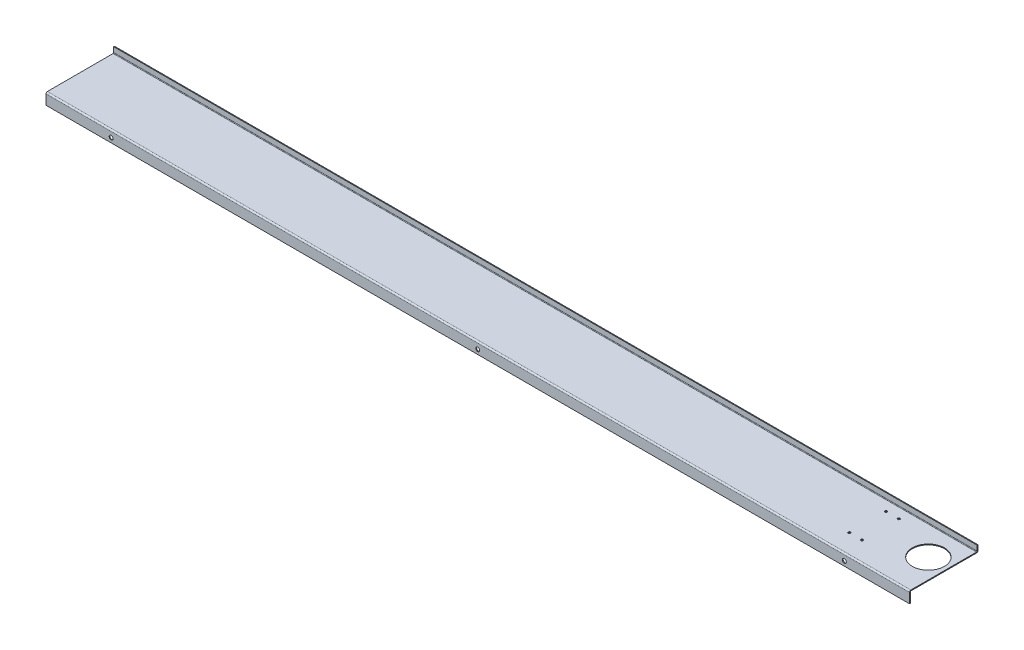
ISO-10303-21;
HEADER;
FILE_DESCRIPTION(('STEP AP214'),'2;1');
FILE_NAME('part.step','',(''),(''),'','','');
FILE_SCHEMA(('AUTOMOTIVE_DESIGN { 1 0 10303 214 1 1 1 1 }'));
ENDSEC;
DATA;
#1=APPLICATION_CONTEXT('core data for automotive mechanical design processes');
#2=APPLICATION_PROTOCOL_DEFINITION('international standard','automotive_design',2000,#1);
#3=PRODUCT_CONTEXT('',#1,'mechanical');
#4=PRODUCT('Part','Part','',(#3));
#5=PRODUCT_RELATED_PRODUCT_CATEGORY('part','',(#4));
#6=PRODUCT_DEFINITION_FORMATION('','',#4);
#7=PRODUCT_DEFINITION_CONTEXT('part definition',#1,'design');
#8=PRODUCT_DEFINITION('design','',#6,#7);
#9=PRODUCT_DEFINITION_SHAPE('','',#8);
#10=(LENGTH_UNIT() NAMED_UNIT(*) SI_UNIT(.MILLI.,.METRE.));
#11=(NAMED_UNIT(*) PLANE_ANGLE_UNIT() SI_UNIT($,.RADIAN.));
#12=(NAMED_UNIT(*) SI_UNIT($,.STERADIAN.) SOLID_ANGLE_UNIT());
#13=UNCERTAINTY_MEASURE_WITH_UNIT(LENGTH_MEASURE(1.E-05),#10,'distance_accuracy_value','');
#14=(GEOMETRIC_REPRESENTATION_CONTEXT(3) GLOBAL_UNCERTAINTY_ASSIGNED_CONTEXT((#13)) GLOBAL_UNIT_ASSIGNED_CONTEXT((#10,
#11,#12)) REPRESENTATION_CONTEXT('',''));
#15=CARTESIAN_POINT('',(0.,0.,0.));
#16=DIRECTION('',(0.,0.,1.));
#17=DIRECTION('',(1.,0.,0.));
#18=AXIS2_PLACEMENT_3D('',#15,#16,#17);
#19=CARTESIAN_POINT('',(765.5,0.,-1.5));
#20=DIRECTION('',(0.,0.,1.));
#21=DIRECTION('',(1.,0.,0.));
#22=AXIS2_PLACEMENT_3D('',#19,#20,#21);
#23=PLANE('',#22);
#24=CARTESIAN_POINT('',(650.,8.,-1.5));
#25=DIRECTION('',(0.,0.,-1.));
#26=DIRECTION('',(-1.,0.,0.));
#27=AXIS2_PLACEMENT_3D('',#24,#25,#26);
#28=CIRCLE('',#27,3.49999999999995);
#29=CARTESIAN_POINT('',(646.5,8.,-1.5));
#30=VERTEX_POINT('',#29);
#31=EDGE_CURVE('E269',#30,#30,#28,.T.);
#32=ORIENTED_EDGE('',*,*,#31,.F.);
#33=EDGE_LOOP('',(#32));
#34=FACE_BOUND('',#33,.T.);
#35=CARTESIAN_POINT('',(0.,8.,-1.5));
#36=DIRECTION('',(0.,0.,-1.));
#37=DIRECTION('',(-1.,0.,0.));
#38=AXIS2_PLACEMENT_3D('',#35,#36,#37);
#39=CIRCLE('',#38,3.49999999999999);
#40=CARTESIAN_POINT('',(-3.49999999999999,8.,-1.5));
#41=VERTEX_POINT('',#40);
#42=EDGE_CURVE('E275',#41,#41,#39,.T.);
#43=ORIENTED_EDGE('',*,*,#42,.F.);
#44=EDGE_LOOP('',(#43));
#45=FACE_BOUND('',#44,.T.);
#46=DIRECTION('',(0.,1.,0.));
#47=VECTOR('',#46,1.);
#48=CARTESIAN_POINT('',(-765.5,0.,-1.5));
#49=LINE('',#48,#47);
#50=CARTESIAN_POINT('',(-765.5,0.,-1.5));
#51=VERTEX_POINT('',#50);
#52=CARTESIAN_POINT('',(-765.5,17.5,-1.5));
#53=VERTEX_POINT('',#52);
#54=EDGE_CURVE('E202',#51,#53,#49,.T.);
#55=ORIENTED_EDGE('',*,*,#54,.T.);
#56=DIRECTION('',(-1.,0.,0.));
#57=VECTOR('',#56,1.);
#58=CARTESIAN_POINT('',(765.5,17.5,-1.5));
#59=LINE('',#58,#57);
#60=CARTESIAN_POINT('',(765.5,17.5,-1.5));
#61=VERTEX_POINT('',#60);
#62=EDGE_CURVE('E167',#61,#53,#59,.T.);
#63=ORIENTED_EDGE('',*,*,#62,.F.);
#64=DIRECTION('',(0.,1.,0.));
#65=VECTOR('',#64,1.);
#66=CARTESIAN_POINT('',(765.5,0.,-1.5));
#67=LINE('',#66,#65);
#68=CARTESIAN_POINT('',(765.5,0.,-1.5));
#69=VERTEX_POINT('',#68);
#70=EDGE_CURVE('E158',#69,#61,#67,.T.);
#71=ORIENTED_EDGE('',*,*,#70,.F.);
#72=DIRECTION('',(-1.,0.,0.));
#73=VECTOR('',#72,1.);
#74=CARTESIAN_POINT('',(765.5,0.,-1.5));
#75=LINE('',#74,#73);
#76=EDGE_CURVE('E214',#69,#51,#75,.T.);
#77=ORIENTED_EDGE('',*,*,#76,.T.);
#78=EDGE_LOOP('',(#55,#63,#71,#77));
#79=FACE_BOUND('',#78,.T.);
#80=CARTESIAN_POINT('',(-650.,8.,-1.5));
#81=DIRECTION('',(0.,0.,-1.));
#82=DIRECTION('',(-1.,0.,0.));
#83=AXIS2_PLACEMENT_3D('',#80,#81,#82);
#84=CIRCLE('',#83,3.49999999999995);
#85=CARTESIAN_POINT('',(-653.5,8.,-1.5));
#86=VERTEX_POINT('',#85);
#87=EDGE_CURVE('E281',#86,#86,#84,.T.);
#88=ORIENTED_EDGE('',*,*,#87,.F.);
#89=EDGE_LOOP('',(#88));
#90=FACE_BOUND('',#89,.T.);
#91=ADVANCED_FACE('F41',(#34,#45,#79,#90),#23,.F.);
#92=CARTESIAN_POINT('',(765.5,20.,-2.5));
#93=DIRECTION('',(1.,0.,0.));
#94=DIRECTION('',(0.,0.,-1.));
#95=AXIS2_PLACEMENT_3D('',#92,#93,#94);
#96=PLANE('',#95);
#97=DIRECTION('',(0.,-1.,0.));
#98=VECTOR('',#97,1.);
#99=CARTESIAN_POINT('',(765.5,20.,-2.5));
#100=LINE('',#99,#98);
#101=CARTESIAN_POINT('',(765.5,20.,-2.5));
#102=VERTEX_POINT('',#101);
#103=CARTESIAN_POINT('',(765.5,18.5,-2.5));
#104=VERTEX_POINT('',#103);
#105=EDGE_CURVE('E11',#102,#104,#100,.T.);
#106=ORIENTED_EDGE('',*,*,#105,.F.);
#107=CARTESIAN_POINT('',(765.5,17.5,-2.5));
#108=DIRECTION('',(1.,0.,0.));
#109=DIRECTION('',(0.,0.,-1.));
#110=AXIS2_PLACEMENT_3D('',#107,#108,#109);
#111=CIRCLE('',#110,2.5);
#112=CARTESIAN_POINT('',(765.5,17.5,0.));
#113=VERTEX_POINT('',#112);
#114=EDGE_CURVE('E297',#113,#102,#111,.F.);
#115=ORIENTED_EDGE('',*,*,#114,.F.);
#116=DIRECTION('',(0.,0.,1.));
#117=VECTOR('',#116,1.);
#118=CARTESIAN_POINT('',(765.5,17.5,-1.5));
#119=LINE('',#118,#117);
#120=EDGE_CURVE('E51',#61,#113,#119,.T.);
#121=ORIENTED_EDGE('',*,*,#120,.F.);
#122=CARTESIAN_POINT('',(765.5,17.5,-2.5));
#123=DIRECTION('',(1.,0.,0.));
#124=DIRECTION('',(0.,0.,-1.));
#125=AXIS2_PLACEMENT_3D('',#122,#123,#124);
#126=CIRCLE('',#125,1.);
#127=EDGE_CURVE('E153',#61,#104,#126,.F.);
#128=ORIENTED_EDGE('',*,*,#127,.T.);
#129=EDGE_LOOP('',(#106,#115,#121,#128));
#130=FACE_BOUND('',#129,.T.);
#131=ADVANCED_FACE('F43',(#130),#96,.T.);
#132=CARTESIAN_POINT('',(765.5,17.5,-1.5));
#133=DIRECTION('',(1.,0.,0.));
#134=DIRECTION('',(0.,0.,-1.));
#135=AXIS2_PLACEMENT_3D('',#132,#133,#134);
#136=PLANE('',#135);
#137=DIRECTION('',(0.,0.,-1.));
#138=VECTOR('',#137,1.);
#139=CARTESIAN_POINT('',(765.5,20.,0.));
#140=LINE('',#139,#138);
#141=CARTESIAN_POINT('',(765.5,20.,-119.));
#142=VERTEX_POINT('',#141);
#143=EDGE_CURVE('E147',#102,#142,#140,.T.);
#144=ORIENTED_EDGE('',*,*,#143,.F.);
#145=ORIENTED_EDGE('',*,*,#105,.T.);
#146=DIRECTION('',(0.,0.,-1.));
#147=VECTOR('',#146,1.);
#148=CARTESIAN_POINT('',(765.5,18.5,0.));
#149=LINE('',#148,#147);
#150=CARTESIAN_POINT('',(765.5,18.5,-119.));
#151=VERTEX_POINT('',#150);
#152=EDGE_CURVE('E144',#104,#151,#149,.T.);
#153=ORIENTED_EDGE('',*,*,#152,.T.);
#154=DIRECTION('',(0.,1.,0.));
#155=VECTOR('',#154,1.);
#156=CARTESIAN_POINT('',(765.5,18.5,-119.));
#157=LINE('',#156,#155);
#158=EDGE_CURVE('E236',#151,#142,#157,.T.);
#159=ORIENTED_EDGE('',*,*,#158,.T.);
#160=EDGE_LOOP('',(#144,#145,#153,#159));
#161=FACE_BOUND('',#160,.T.);
#162=ADVANCED_FACE('F142',(#161),#136,.T.);
#163=CARTESIAN_POINT('',(-765.5,17.5,0.));
#164=DIRECTION('',(-1.,0.,0.));
#165=DIRECTION('',(0.,0.,1.));
#166=AXIS2_PLACEMENT_3D('',#163,#164,#165);
#167=PLANE('',#166);
#168=DIRECTION('',(0.,0.,-1.));
#169=VECTOR('',#168,1.);
#170=CARTESIAN_POINT('',(-765.5,17.5,0.));
#171=LINE('',#170,#169);
#172=CARTESIAN_POINT('',(-765.5,17.5,0.));
#173=VERTEX_POINT('',#172);
#174=EDGE_CURVE('E241',#173,#53,#171,.T.);
#175=ORIENTED_EDGE('',*,*,#174,.F.);
#176=CARTESIAN_POINT('',(-765.5,17.5,-2.5));
#177=DIRECTION('',(1.,0.,0.));
#178=DIRECTION('',(0.,0.,-1.));
#179=AXIS2_PLACEMENT_3D('',#176,#177,#178);
#180=CIRCLE('',#179,2.5);
#181=CARTESIAN_POINT('',(-765.5,20.,-2.5));
#182=VERTEX_POINT('',#181);
#183=EDGE_CURVE('E193',#173,#182,#180,.F.);
#184=ORIENTED_EDGE('',*,*,#183,.T.);
#185=DIRECTION('',(0.,1.,0.));
#186=VECTOR('',#185,1.);
#187=CARTESIAN_POINT('',(-765.5,18.5,-2.5));
#188=LINE('',#187,#186);
#189=CARTESIAN_POINT('',(-765.5,18.5,-2.5));
#190=VERTEX_POINT('',#189);
#191=EDGE_CURVE('E239',#190,#182,#188,.T.);
#192=ORIENTED_EDGE('',*,*,#191,.F.);
#193=CARTESIAN_POINT('',(-765.5,17.5,-2.5));
#194=DIRECTION('',(1.,0.,0.));
#195=DIRECTION('',(0.,0.,-1.));
#196=AXIS2_PLACEMENT_3D('',#193,#194,#195);
#197=CIRCLE('',#196,1.);
#198=EDGE_CURVE('E165',#53,#190,#197,.F.);
#199=ORIENTED_EDGE('',*,*,#198,.F.);
#200=EDGE_LOOP('',(#175,#184,#192,#199));
#201=FACE_BOUND('',#200,.T.);
#202=ADVANCED_FACE('F315',(#201),#167,.T.);
#203=CARTESIAN_POINT('',(-765.5,18.5,-2.5));
#204=DIRECTION('',(-1.,0.,0.));
#205=DIRECTION('',(0.,0.,1.));
#206=AXIS2_PLACEMENT_3D('',#203,#204,#205);
#207=PLANE('',#206);
#208=DIRECTION('',(0.,1.,0.));
#209=VECTOR('',#208,1.);
#210=CARTESIAN_POINT('',(-765.5,0.,0.));
#211=LINE('',#210,#209);
#212=CARTESIAN_POINT('',(-765.5,0.,0.));
#213=VERTEX_POINT('',#212);
#214=EDGE_CURVE('E196',#213,#173,#211,.T.);
#215=ORIENTED_EDGE('',*,*,#214,.T.);
#216=ORIENTED_EDGE('',*,*,#174,.T.);
#217=ORIENTED_EDGE('',*,*,#54,.F.);
#218=DIRECTION('',(0.,0.,1.));
#219=VECTOR('',#218,1.);
#220=CARTESIAN_POINT('',(-765.5,0.,-1.5));
#221=LINE('',#220,#219);
#222=EDGE_CURVE('E199',#51,#213,#221,.T.);
#223=ORIENTED_EDGE('',*,*,#222,.T.);
#224=EDGE_LOOP('',(#215,#216,#217,#223));
#225=FACE_BOUND('',#224,.T.);
#226=ADVANCED_FACE('F578',(#225),#207,.T.);
#227=CARTESIAN_POINT('',(765.5,21.,-120.));
#228=DIRECTION('',(1.,0.,0.));
#229=DIRECTION('',(0.,0.,-1.));
#230=AXIS2_PLACEMENT_3D('',#227,#228,#229);
#231=PLANE('',#230);
#232=DIRECTION('',(0.,0.,-1.));
#233=VECTOR('',#232,1.);
#234=CARTESIAN_POINT('',(765.5,21.,-120.));
#235=LINE('',#234,#233);
#236=CARTESIAN_POINT('',(765.5,21.,-120.));
#237=VERTEX_POINT('',#236);
#238=CARTESIAN_POINT('',(765.5,21.,-121.5));
#239=VERTEX_POINT('',#238);
#240=EDGE_CURVE('E60',#237,#239,#235,.T.);
#241=ORIENTED_EDGE('',*,*,#240,.F.);
#242=CARTESIAN_POINT('',(765.5,21.,-119.));
#243=DIRECTION('',(-1.,0.,0.));
#244=DIRECTION('',(0.,0.,1.));
#245=AXIS2_PLACEMENT_3D('',#242,#243,#244);
#246=CIRCLE('',#245,1.);
#247=EDGE_CURVE('E293',#142,#237,#246,.F.);
#248=ORIENTED_EDGE('',*,*,#247,.F.);
#249=ORIENTED_EDGE('',*,*,#158,.F.);
#250=CARTESIAN_POINT('',(765.5,21.,-119.));
#251=DIRECTION('',(1.,0.,0.));
#252=DIRECTION('',(0.,0.,-1.));
#253=AXIS2_PLACEMENT_3D('',#250,#251,#252);
#254=CIRCLE('',#253,2.5);
#255=EDGE_CURVE('E173',#151,#239,#254,.T.);
#256=ORIENTED_EDGE('',*,*,#255,.T.);
#257=EDGE_LOOP('',(#241,#248,#249,#256));
#258=FACE_BOUND('',#257,.T.);
#259=ADVANCED_FACE('F568',(#258),#231,.T.);
#260=CARTESIAN_POINT('',(765.5,18.5,-119.));
#261=DIRECTION('',(1.,0.,0.));
#262=DIRECTION('',(0.,0.,-1.));
#263=AXIS2_PLACEMENT_3D('',#260,#261,#262);
#264=PLANE('',#263);
#265=DIRECTION('',(0.,1.,0.));
#266=VECTOR('',#265,1.);
#267=CARTESIAN_POINT('',(765.5,20.,-120.));
#268=LINE('',#267,#266);
#269=CARTESIAN_POINT('',(765.5,30.,-120.));
#270=VERTEX_POINT('',#269);
#271=EDGE_CURVE('E290',#237,#270,#268,.T.);
#272=ORIENTED_EDGE('',*,*,#271,.F.);
#273=ORIENTED_EDGE('',*,*,#240,.T.);
#274=DIRECTION('',(0.,1.,0.));
#275=VECTOR('',#274,1.);
#276=CARTESIAN_POINT('',(765.5,20.,-121.5));
#277=LINE('',#276,#275);
#278=CARTESIAN_POINT('',(765.5,30.,-121.5));
#279=VERTEX_POINT('',#278);
#280=EDGE_CURVE('E114',#239,#279,#277,.T.);
#281=ORIENTED_EDGE('',*,*,#280,.T.);
#282=DIRECTION('',(0.,0.,-1.));
#283=VECTOR('',#282,1.);
#284=CARTESIAN_POINT('',(765.5,30.,-120.));
#285=LINE('',#284,#283);
#286=EDGE_CURVE('E287',#270,#279,#285,.T.);
#287=ORIENTED_EDGE('',*,*,#286,.F.);
#288=EDGE_LOOP('',(#272,#273,#281,#287));
#289=FACE_BOUND('',#288,.T.);
#290=ADVANCED_FACE('F342',(#289),#264,.T.);
#291=CARTESIAN_POINT('',(-765.5,20.,-119.));
#292=DIRECTION('',(-1.,0.,0.));
#293=DIRECTION('',(0.,0.,1.));
#294=AXIS2_PLACEMENT_3D('',#291,#292,#293);
#295=PLANE('',#294);
#296=DIRECTION('',(0.,-1.,0.));
#297=VECTOR('',#296,1.);
#298=CARTESIAN_POINT('',(-765.5,20.,-119.));
#299=LINE('',#298,#297);
#300=CARTESIAN_POINT('',(-765.5,20.,-119.));
#301=VERTEX_POINT('',#300);
#302=CARTESIAN_POINT('',(-765.5,18.5,-119.));
#303=VERTEX_POINT('',#302);
#304=EDGE_CURVE('E101',#301,#303,#299,.T.);
#305=ORIENTED_EDGE('',*,*,#304,.F.);
#306=CARTESIAN_POINT('',(-765.5,21.,-119.));
#307=DIRECTION('',(-1.,0.,0.));
#308=DIRECTION('',(0.,0.,1.));
#309=AXIS2_PLACEMENT_3D('',#306,#307,#308);
#310=CIRCLE('',#309,1.);
#311=CARTESIAN_POINT('',(-765.5,21.,-120.));
#312=VERTEX_POINT('',#311);
#313=EDGE_CURVE('E189',#301,#312,#310,.F.);
#314=ORIENTED_EDGE('',*,*,#313,.T.);
#315=DIRECTION('',(0.,0.,1.));
#316=VECTOR('',#315,1.);
#317=CARTESIAN_POINT('',(-765.5,21.,-121.5));
#318=LINE('',#317,#316);
#319=CARTESIAN_POINT('',(-765.5,21.,-121.5));
#320=VERTEX_POINT('',#319);
#321=EDGE_CURVE('E108',#320,#312,#318,.T.);
#322=ORIENTED_EDGE('',*,*,#321,.F.);
#323=CARTESIAN_POINT('',(-765.5,21.,-119.));
#324=DIRECTION('',(1.,0.,0.));
#325=DIRECTION('',(0.,0.,-1.));
#326=AXIS2_PLACEMENT_3D('',#323,#324,#325);
#327=CIRCLE('',#326,2.5);
#328=EDGE_CURVE('E208',#303,#320,#327,.T.);
#329=ORIENTED_EDGE('',*,*,#328,.F.);
#330=EDGE_LOOP('',(#305,#314,#322,#329));
#331=FACE_BOUND('',#330,.T.);
#332=ADVANCED_FACE('F330',(#331),#295,.T.);
#333=CARTESIAN_POINT('',(-765.5,21.,-121.5));
#334=DIRECTION('',(-1.,0.,0.));
#335=DIRECTION('',(0.,0.,1.));
#336=AXIS2_PLACEMENT_3D('',#333,#334,#335);
#337=PLANE('',#336);
#338=DIRECTION('',(0.,0.,-1.));
#339=VECTOR('',#338,1.);
#340=CARTESIAN_POINT('',(-765.5,20.,0.));
#341=LINE('',#340,#339);
#342=EDGE_CURVE('E191',#182,#301,#341,.T.);
#343=ORIENTED_EDGE('',*,*,#342,.T.);
#344=ORIENTED_EDGE('',*,*,#304,.T.);
#345=DIRECTION('',(0.,0.,-1.));
#346=VECTOR('',#345,1.);
#347=CARTESIAN_POINT('',(-765.5,18.5,0.));
#348=LINE('',#347,#346);
#349=EDGE_CURVE('E206',#190,#303,#348,.T.);
#350=ORIENTED_EDGE('',*,*,#349,.F.);
#351=ORIENTED_EDGE('',*,*,#191,.T.);
#352=EDGE_LOOP('',(#343,#344,#350,#351));
#353=FACE_BOUND('',#352,.T.);
#354=ADVANCED_FACE('F317',(#353),#337,.T.);
#355=CARTESIAN_POINT('',(765.5,20.,-121.5));
#356=DIRECTION('',(0.,0.,1.));
#357=DIRECTION('',(1.,0.,0.));
#358=AXIS2_PLACEMENT_3D('',#355,#356,#357);
#359=PLANE('',#358);
#360=DIRECTION('',(0.,1.,0.));
#361=VECTOR('',#360,1.);
#362=CARTESIAN_POINT('',(-765.5,20.,-121.5));
#363=LINE('',#362,#361);
#364=CARTESIAN_POINT('',(-765.5,30.,-121.5));
#365=VERTEX_POINT('',#364);
#366=EDGE_CURVE('E179',#320,#365,#363,.T.);
#367=ORIENTED_EDGE('',*,*,#366,.T.);
#368=DIRECTION('',(-1.,0.,0.));
#369=VECTOR('',#368,1.);
#370=CARTESIAN_POINT('',(765.5,30.,-121.5));
#371=LINE('',#370,#369);
#372=EDGE_CURVE('E232',#279,#365,#371,.T.);
#373=ORIENTED_EDGE('',*,*,#372,.F.);
#374=ORIENTED_EDGE('',*,*,#280,.F.);
#375=DIRECTION('',(-1.,0.,0.));
#376=VECTOR('',#375,1.);
#377=CARTESIAN_POINT('',(765.5,21.,-121.5));
#378=LINE('',#377,#376);
#379=EDGE_CURVE('E175',#239,#320,#378,.T.);
#380=ORIENTED_EDGE('',*,*,#379,.T.);
#381=EDGE_LOOP('',(#367,#373,#374,#380));
#382=FACE_BOUND('',#381,.T.);
#383=ADVANCED_FACE('F336',(#382),#359,.F.);
#384=CARTESIAN_POINT('',(765.5,30.,-120.));
#385=DIRECTION('',(0.,1.,0.));
#386=DIRECTION('',(0.,0.,1.));
#387=AXIS2_PLACEMENT_3D('',#384,#385,#386);
#388=PLANE('',#387);
#389=DIRECTION('',(0.,0.,-1.));
#390=VECTOR('',#389,1.);
#391=CARTESIAN_POINT('',(-765.5,30.,-120.));
#392=LINE('',#391,#390);
#393=CARTESIAN_POINT('',(-765.5,30.,-120.));
#394=VERTEX_POINT('',#393);
#395=EDGE_CURVE('E182',#394,#365,#392,.T.);
#396=ORIENTED_EDGE('',*,*,#395,.F.);
#397=DIRECTION('',(-1.,0.,0.));
#398=VECTOR('',#397,1.);
#399=CARTESIAN_POINT('',(765.5,30.,-120.));
#400=LINE('',#399,#398);
#401=EDGE_CURVE('E230',#270,#394,#400,.T.);
#402=ORIENTED_EDGE('',*,*,#401,.F.);
#403=ORIENTED_EDGE('',*,*,#286,.T.);
#404=ORIENTED_EDGE('',*,*,#372,.T.);
#405=EDGE_LOOP('',(#396,#402,#403,#404));
#406=FACE_BOUND('',#405,.T.);
#407=ADVANCED_FACE('F341',(#406),#388,.T.);
#408=CARTESIAN_POINT('',(765.5,20.,-120.));
#409=DIRECTION('',(0.,0.,1.));
#410=DIRECTION('',(1.,0.,0.));
#411=AXIS2_PLACEMENT_3D('',#408,#409,#410);
#412=PLANE('',#411);
#413=DIRECTION('',(0.,1.,0.));
#414=VECTOR('',#413,1.);
#415=CARTESIAN_POINT('',(-765.5,20.,-120.));
#416=LINE('',#415,#414);
#417=EDGE_CURVE('E186',#312,#394,#416,.T.);
#418=ORIENTED_EDGE('',*,*,#417,.F.);
#419=DIRECTION('',(-1.,0.,0.));
#420=VECTOR('',#419,1.);
#421=CARTESIAN_POINT('',(765.5,21.,-120.));
#422=LINE('',#421,#420);
#423=EDGE_CURVE('E227',#237,#312,#422,.T.);
#424=ORIENTED_EDGE('',*,*,#423,.F.);
#425=ORIENTED_EDGE('',*,*,#271,.T.);
#426=ORIENTED_EDGE('',*,*,#401,.T.);
#427=EDGE_LOOP('',(#418,#424,#425,#426));
#428=FACE_BOUND('',#427,.T.);
#429=ADVANCED_FACE('F344',(#428),#412,.T.);
#430=CARTESIAN_POINT('',(765.5,21.,-119.));
#431=DIRECTION('',(-1.,0.,0.));
#432=DIRECTION('',(0.,0.,1.));
#433=AXIS2_PLACEMENT_3D('',#430,#431,#432);
#434=CYLINDRICAL_SURFACE('',#433,1.);
#435=ORIENTED_EDGE('',*,*,#313,.F.);
#436=DIRECTION('',(-1.,0.,0.));
#437=VECTOR('',#436,1.);
#438=CARTESIAN_POINT('',(765.5,20.,-119.));
#439=LINE('',#438,#437);
#440=EDGE_CURVE('E224',#142,#301,#439,.T.);
#441=ORIENTED_EDGE('',*,*,#440,.F.);
#442=ORIENTED_EDGE('',*,*,#247,.T.);
#443=ORIENTED_EDGE('',*,*,#423,.T.);
#444=EDGE_LOOP('',(#435,#441,#442,#443));
#445=FACE_BOUND('',#444,.T.);
#446=ADVANCED_FACE('F327',(#445),#434,.F.);
#447=CARTESIAN_POINT('',(765.5,20.,0.));
#448=DIRECTION('',(0.,1.,0.));
#449=DIRECTION('',(0.,0.,1.));
#450=AXIS2_PLACEMENT_3D('',#447,#448,#449);
#451=PLANE('',#450);
#452=CARTESIAN_POINT('',(730.5,20.,-68.5));
#453=DIRECTION('',(0.,1.,0.));
#454=DIRECTION('',(0.,0.,1.));
#455=AXIS2_PLACEMENT_3D('',#452,#453,#454);
#456=CIRCLE('',#455,28.5);
#457=CARTESIAN_POINT('',(730.5,20.,-40.));
#458=VERTEX_POINT('',#457);
#459=EDGE_CURVE('E381',#458,#458,#456,.T.);
#460=ORIENTED_EDGE('',*,*,#459,.F.);
#461=EDGE_LOOP('',(#460));
#462=FACE_BOUND('',#461,.T.);
#463=CARTESIAN_POINT('',(645.5,20.,-36.));
#464=DIRECTION('',(0.,1.,0.));
#465=DIRECTION('',(0.,0.,1.));
#466=AXIS2_PLACEMENT_3D('',#463,#464,#465);
#467=CIRCLE('',#466,2.09999999999999);
#468=CARTESIAN_POINT('',(645.5,20.,-33.9));
#469=VERTEX_POINT('',#468);
#470=EDGE_CURVE('E260',#469,#469,#467,.T.);
#471=ORIENTED_EDGE('',*,*,#470,.F.);
#472=EDGE_LOOP('',(#471));
#473=FACE_BOUND('',#472,.T.);
#474=CARTESIAN_POINT('',(623.,20.,-36.));
#475=DIRECTION('',(0.,1.,0.));
#476=DIRECTION('',(0.,0.,1.));
#477=AXIS2_PLACEMENT_3D('',#474,#475,#476);
#478=CIRCLE('',#477,2.09999999999999);
#479=CARTESIAN_POINT('',(623.,20.,-33.9));
#480=VERTEX_POINT('',#479);
#481=EDGE_CURVE('E250',#480,#480,#478,.T.);
#482=ORIENTED_EDGE('',*,*,#481,.F.);
#483=EDGE_LOOP('',(#482));
#484=FACE_BOUND('',#483,.T.);
#485=CARTESIAN_POINT('',(623.,20.,-101.));
#486=DIRECTION('',(0.,1.,0.));
#487=DIRECTION('',(0.,0.,1.));
#488=AXIS2_PLACEMENT_3D('',#485,#486,#487);
#489=CIRCLE('',#488,2.09999999999999);
#490=CARTESIAN_POINT('',(623.,20.,-98.9));
#491=VERTEX_POINT('',#490);
#492=EDGE_CURVE('E247',#491,#491,#489,.T.);
#493=ORIENTED_EDGE('',*,*,#492,.F.);
#494=EDGE_LOOP('',(#493));
#495=FACE_BOUND('',#494,.T.);
#496=CARTESIAN_POINT('',(645.5,20.,-101.));
#497=DIRECTION('',(0.,1.,0.));
#498=DIRECTION('',(0.,0.,1.));
#499=AXIS2_PLACEMENT_3D('',#496,#497,#498);
#500=CIRCLE('',#499,2.09999999999999);
#501=CARTESIAN_POINT('',(645.5,20.,-98.9));
#502=VERTEX_POINT('',#501);
#503=EDGE_CURVE('E246',#502,#502,#500,.T.);
#504=ORIENTED_EDGE('',*,*,#503,.F.);
#505=EDGE_LOOP('',(#504));
#506=FACE_BOUND('',#505,.T.);
#507=ORIENTED_EDGE('',*,*,#342,.F.);
#508=DIRECTION('',(-1.,0.,0.));
#509=VECTOR('',#508,1.);
#510=CARTESIAN_POINT('',(765.5,20.,-2.5));
#511=LINE('',#510,#509);
#512=EDGE_CURVE('E221',#102,#182,#511,.T.);
#513=ORIENTED_EDGE('',*,*,#512,.F.);
#514=ORIENTED_EDGE('',*,*,#143,.T.);
#515=ORIENTED_EDGE('',*,*,#440,.T.);
#516=EDGE_LOOP('',(#507,#513,#514,#515));
#517=FACE_BOUND('',#516,.T.);
#518=ADVANCED_FACE('F322',(#462,#473,#484,#495,#506,#517),#451,.T.);
#519=CARTESIAN_POINT('',(765.5,17.5,-2.5));
#520=DIRECTION('',(-1.,0.,0.));
#521=DIRECTION('',(0.,0.,1.));
#522=AXIS2_PLACEMENT_3D('',#519,#520,#521);
#523=CYLINDRICAL_SURFACE('',#522,2.5);
#524=ORIENTED_EDGE('',*,*,#183,.F.);
#525=DIRECTION('',(-1.,0.,0.));
#526=VECTOR('',#525,1.);
#527=CARTESIAN_POINT('',(765.5,17.5,0.));
#528=LINE('',#527,#526);
#529=EDGE_CURVE('E218',#113,#173,#528,.T.);
#530=ORIENTED_EDGE('',*,*,#529,.F.);
#531=ORIENTED_EDGE('',*,*,#114,.T.);
#532=ORIENTED_EDGE('',*,*,#512,.T.);
#533=EDGE_LOOP('',(#524,#530,#531,#532));
#534=FACE_BOUND('',#533,.T.);
#535=ADVANCED_FACE('F320',(#534),#523,.T.);
#536=CARTESIAN_POINT('',(765.5,0.,0.));
#537=DIRECTION('',(0.,0.,1.));
#538=DIRECTION('',(1.,0.,0.));
#539=AXIS2_PLACEMENT_3D('',#536,#537,#538);
#540=PLANE('',#539);
#541=CARTESIAN_POINT('',(650.,8.,0.));
#542=DIRECTION('',(0.,0.,1.));
#543=DIRECTION('',(1.,0.,0.));
#544=AXIS2_PLACEMENT_3D('',#541,#542,#543);
#545=CIRCLE('',#544,3.49999999999995);
#546=CARTESIAN_POINT('',(653.5,8.,0.));
#547=VERTEX_POINT('',#546);
#548=EDGE_CURVE('E272',#547,#547,#545,.T.);
#549=ORIENTED_EDGE('',*,*,#548,.F.);
#550=EDGE_LOOP('',(#549));
#551=FACE_BOUND('',#550,.T.);
#552=CARTESIAN_POINT('',(0.,8.,0.));
#553=DIRECTION('',(0.,0.,1.));
#554=DIRECTION('',(1.,0.,0.));
#555=AXIS2_PLACEMENT_3D('',#552,#553,#554);
#556=CIRCLE('',#555,3.49999999999999);
#557=CARTESIAN_POINT('',(3.49999999999999,8.,0.));
#558=VERTEX_POINT('',#557);
#559=EDGE_CURVE('E278',#558,#558,#556,.T.);
#560=ORIENTED_EDGE('',*,*,#559,.F.);
#561=EDGE_LOOP('',(#560));
#562=FACE_BOUND('',#561,.T.);
#563=CARTESIAN_POINT('',(-650.,8.,0.));
#564=DIRECTION('',(0.,0.,1.));
#565=DIRECTION('',(1.,0.,0.));
#566=AXIS2_PLACEMENT_3D('',#563,#564,#565);
#567=CIRCLE('',#566,3.49999999999995);
#568=CARTESIAN_POINT('',(-646.5,8.,0.));
#569=VERTEX_POINT('',#568);
#570=EDGE_CURVE('E183',#569,#569,#567,.T.);
#571=ORIENTED_EDGE('',*,*,#570,.F.);
#572=EDGE_LOOP('',(#571));
#573=FACE_BOUND('',#572,.T.);
#574=ORIENTED_EDGE('',*,*,#214,.F.);
#575=DIRECTION('',(-1.,0.,0.));
#576=VECTOR('',#575,1.);
#577=CARTESIAN_POINT('',(765.5,0.,0.));
#578=LINE('',#577,#576);
#579=CARTESIAN_POINT('',(765.5,0.,0.));
#580=VERTEX_POINT('',#579);
#581=EDGE_CURVE('E216',#580,#213,#578,.T.);
#582=ORIENTED_EDGE('',*,*,#581,.F.);
#583=DIRECTION('',(0.,1.,0.));
#584=VECTOR('',#583,1.);
#585=CARTESIAN_POINT('',(765.5,0.,0.));
#586=LINE('',#585,#584);
#587=EDGE_CURVE('E299',#580,#113,#586,.T.);
#588=ORIENTED_EDGE('',*,*,#587,.T.);
#589=ORIENTED_EDGE('',*,*,#529,.T.);
#590=EDGE_LOOP('',(#574,#582,#588,#589));
#591=FACE_BOUND('',#590,.T.);
#592=ADVANCED_FACE('F367',(#551,#562,#573,#591),#540,.T.);
#593=CARTESIAN_POINT('',(765.5,0.,-1.5));
#594=DIRECTION('',(0.,-1.,0.));
#595=DIRECTION('',(0.,0.,-1.));
#596=AXIS2_PLACEMENT_3D('',#593,#594,#595);
#597=PLANE('',#596);
#598=ORIENTED_EDGE('',*,*,#222,.F.);
#599=ORIENTED_EDGE('',*,*,#76,.F.);
#600=DIRECTION('',(0.,0.,1.));
#601=VECTOR('',#600,1.);
#602=CARTESIAN_POINT('',(765.5,0.,-1.5));
#603=LINE('',#602,#601);
#604=EDGE_CURVE('E302',#69,#580,#603,.T.);
#605=ORIENTED_EDGE('',*,*,#604,.T.);
#606=ORIENTED_EDGE('',*,*,#581,.T.);
#607=EDGE_LOOP('',(#598,#599,#605,#606));
#608=FACE_BOUND('',#607,.T.);
#609=ADVANCED_FACE('F364',(#608),#597,.T.);
#610=CARTESIAN_POINT('',(765.5,17.5,-2.5));
#611=DIRECTION('',(-1.,0.,0.));
#612=DIRECTION('',(0.,0.,1.));
#613=AXIS2_PLACEMENT_3D('',#610,#611,#612);
#614=CYLINDRICAL_SURFACE('',#613,1.);
#615=ORIENTED_EDGE('',*,*,#198,.T.);
#616=DIRECTION('',(-1.,0.,0.));
#617=VECTOR('',#616,1.);
#618=CARTESIAN_POINT('',(765.5,18.5,-2.5));
#619=LINE('',#618,#617);
#620=EDGE_CURVE('E162',#104,#190,#619,.T.);
#621=ORIENTED_EDGE('',*,*,#620,.F.);
#622=ORIENTED_EDGE('',*,*,#127,.F.);
#623=ORIENTED_EDGE('',*,*,#62,.T.);
#624=EDGE_LOOP('',(#615,#621,#622,#623));
#625=FACE_BOUND('',#624,.T.);
#626=ADVANCED_FACE('F163',(#625),#614,.F.);
#627=CARTESIAN_POINT('',(765.5,18.5,0.));
#628=DIRECTION('',(0.,1.,0.));
#629=DIRECTION('',(0.,0.,1.));
#630=AXIS2_PLACEMENT_3D('',#627,#628,#629);
#631=PLANE('',#630);
#632=CARTESIAN_POINT('',(730.5,18.5,-68.5));
#633=DIRECTION('',(0.,1.,0.));
#634=DIRECTION('',(0.,0.,1.));
#635=AXIS2_PLACEMENT_3D('',#632,#633,#634);
#636=CIRCLE('',#635,28.5);
#637=CARTESIAN_POINT('',(730.5,18.5,-40.));
#638=VERTEX_POINT('',#637);
#639=EDGE_CURVE('E440',#638,#638,#636,.T.);
#640=ORIENTED_EDGE('',*,*,#639,.T.);
#641=EDGE_LOOP('',(#640));
#642=FACE_BOUND('',#641,.T.);
#643=CARTESIAN_POINT('',(645.5,18.5,-36.));
#644=DIRECTION('',(0.,1.,0.));
#645=DIRECTION('',(0.,0.,1.));
#646=AXIS2_PLACEMENT_3D('',#643,#644,#645);
#647=CIRCLE('',#646,2.09999999999999);
#648=CARTESIAN_POINT('',(645.5,18.5,-33.9));
#649=VERTEX_POINT('',#648);
#650=EDGE_CURVE('E45',#649,#649,#647,.T.);
#651=ORIENTED_EDGE('',*,*,#650,.T.);
#652=EDGE_LOOP('',(#651));
#653=FACE_BOUND('',#652,.T.);
#654=CARTESIAN_POINT('',(623.,18.5,-36.));
#655=DIRECTION('',(0.,1.,0.));
#656=DIRECTION('',(0.,0.,1.));
#657=AXIS2_PLACEMENT_3D('',#654,#655,#656);
#658=CIRCLE('',#657,2.09999999999999);
#659=CARTESIAN_POINT('',(623.,18.5,-33.9));
#660=VERTEX_POINT('',#659);
#661=EDGE_CURVE('E248',#660,#660,#658,.T.);
#662=ORIENTED_EDGE('',*,*,#661,.T.);
#663=EDGE_LOOP('',(#662));
#664=FACE_BOUND('',#663,.T.);
#665=CARTESIAN_POINT('',(623.,18.5,-101.));
#666=DIRECTION('',(0.,1.,0.));
#667=DIRECTION('',(0.,0.,1.));
#668=AXIS2_PLACEMENT_3D('',#665,#666,#667);
#669=CIRCLE('',#668,2.09999999999999);
#670=CARTESIAN_POINT('',(623.,18.5,-98.9));
#671=VERTEX_POINT('',#670);
#672=EDGE_CURVE('E244',#671,#671,#669,.T.);
#673=ORIENTED_EDGE('',*,*,#672,.T.);
#674=EDGE_LOOP('',(#673));
#675=FACE_BOUND('',#674,.T.);
#676=CARTESIAN_POINT('',(645.5,18.5,-101.));
#677=DIRECTION('',(0.,1.,0.));
#678=DIRECTION('',(0.,0.,1.));
#679=AXIS2_PLACEMENT_3D('',#676,#677,#678);
#680=CIRCLE('',#679,2.09999999999999);
#681=CARTESIAN_POINT('',(645.5,18.5,-98.9));
#682=VERTEX_POINT('',#681);
#683=EDGE_CURVE('E266',#682,#682,#680,.T.);
#684=ORIENTED_EDGE('',*,*,#683,.T.);
#685=EDGE_LOOP('',(#684));
#686=FACE_BOUND('',#685,.T.);
#687=ORIENTED_EDGE('',*,*,#349,.T.);
#688=DIRECTION('',(-1.,0.,0.));
#689=VECTOR('',#688,1.);
#690=CARTESIAN_POINT('',(765.5,18.5,-119.));
#691=LINE('',#690,#689);
#692=EDGE_CURVE('E168',#151,#303,#691,.T.);
#693=ORIENTED_EDGE('',*,*,#692,.F.);
#694=ORIENTED_EDGE('',*,*,#152,.F.);
#695=ORIENTED_EDGE('',*,*,#620,.T.);
#696=EDGE_LOOP('',(#687,#693,#694,#695));
#697=FACE_BOUND('',#696,.T.);
#698=ADVANCED_FACE('F170',(#642,#653,#664,#675,#686,#697),#631,.F.);
#699=CARTESIAN_POINT('',(765.5,21.,-119.));
#700=DIRECTION('',(-1.,0.,0.));
#701=DIRECTION('',(0.,0.,1.));
#702=AXIS2_PLACEMENT_3D('',#699,#700,#701);
#703=CYLINDRICAL_SURFACE('',#702,2.5);
#704=ORIENTED_EDGE('',*,*,#328,.T.);
#705=ORIENTED_EDGE('',*,*,#379,.F.);
#706=ORIENTED_EDGE('',*,*,#255,.F.);
#707=ORIENTED_EDGE('',*,*,#692,.T.);
#708=EDGE_LOOP('',(#704,#705,#706,#707));
#709=FACE_BOUND('',#708,.T.);
#710=ADVANCED_FACE('F333',(#709),#703,.T.);
#711=CARTESIAN_POINT('',(765.5,21.,-119.));
#712=DIRECTION('',(-1.,0.,0.));
#713=DIRECTION('',(0.,0.,1.));
#714=AXIS2_PLACEMENT_3D('',#711,#712,#713);
#715=PLANE('',#714);
#716=ORIENTED_EDGE('',*,*,#70,.T.);
#717=ORIENTED_EDGE('',*,*,#120,.T.);
#718=ORIENTED_EDGE('',*,*,#587,.F.);
#719=ORIENTED_EDGE('',*,*,#604,.F.);
#720=EDGE_LOOP('',(#716,#717,#718,#719));
#721=FACE_BOUND('',#720,.T.);
#722=ADVANCED_FACE('F308',(#721),#715,.F.);
#723=CARTESIAN_POINT('',(-765.5,21.,-119.));
#724=DIRECTION('',(-1.,0.,0.));
#725=DIRECTION('',(0.,0.,1.));
#726=AXIS2_PLACEMENT_3D('',#723,#724,#725);
#727=PLANE('',#726);
#728=ORIENTED_EDGE('',*,*,#366,.F.);
#729=ORIENTED_EDGE('',*,*,#321,.T.);
#730=ORIENTED_EDGE('',*,*,#417,.T.);
#731=ORIENTED_EDGE('',*,*,#395,.T.);
#732=EDGE_LOOP('',(#728,#729,#730,#731));
#733=FACE_BOUND('',#732,.T.);
#734=ADVANCED_FACE('F338',(#733),#727,.T.);
#735=CARTESIAN_POINT('',(-650.,8.,-1.5));
#736=DIRECTION('',(0.,0.,-1.));
#737=DIRECTION('',(-1.,0.,0.));
#738=AXIS2_PLACEMENT_3D('',#735,#736,#737);
#739=CYLINDRICAL_SURFACE('',#738,3.49999999999995);
#740=ORIENTED_EDGE('',*,*,#87,.T.);
#741=EDGE_LOOP('',(#740));
#742=FACE_BOUND('',#741,.T.);
#743=ORIENTED_EDGE('',*,*,#570,.T.);
#744=EDGE_LOOP('',(#743));
#745=FACE_BOUND('',#744,.T.);
#746=ADVANCED_FACE('F410',(#742,#745),#739,.F.);
#747=CARTESIAN_POINT('',(0.,8.,-1.5));
#748=DIRECTION('',(0.,0.,-1.));
#749=DIRECTION('',(-1.,0.,0.));
#750=AXIS2_PLACEMENT_3D('',#747,#748,#749);
#751=CYLINDRICAL_SURFACE('',#750,3.49999999999999);
#752=ORIENTED_EDGE('',*,*,#42,.T.);
#753=EDGE_LOOP('',(#752));
#754=FACE_BOUND('',#753,.T.);
#755=ORIENTED_EDGE('',*,*,#559,.T.);
#756=EDGE_LOOP('',(#755));
#757=FACE_BOUND('',#756,.T.);
#758=ADVANCED_FACE('F415',(#754,#757),#751,.F.);
#759=CARTESIAN_POINT('',(650.,8.,-1.5));
#760=DIRECTION('',(0.,0.,-1.));
#761=DIRECTION('',(-1.,0.,0.));
#762=AXIS2_PLACEMENT_3D('',#759,#760,#761);
#763=CYLINDRICAL_SURFACE('',#762,3.49999999999995);
#764=ORIENTED_EDGE('',*,*,#31,.T.);
#765=EDGE_LOOP('',(#764));
#766=FACE_BOUND('',#765,.T.);
#767=ORIENTED_EDGE('',*,*,#548,.T.);
#768=EDGE_LOOP('',(#767));
#769=FACE_BOUND('',#768,.T.);
#770=ADVANCED_FACE('F394',(#766,#769),#763,.F.);
#771=CARTESIAN_POINT('',(645.5,20.,-101.));
#772=DIRECTION('',(0.,1.,0.));
#773=DIRECTION('',(0.,0.,1.));
#774=AXIS2_PLACEMENT_3D('',#771,#772,#773);
#775=CYLINDRICAL_SURFACE('',#774,2.09999999999999);
#776=ORIENTED_EDGE('',*,*,#503,.T.);
#777=EDGE_LOOP('',(#776));
#778=FACE_BOUND('',#777,.T.);
#779=ORIENTED_EDGE('',*,*,#683,.F.);
#780=EDGE_LOOP('',(#779));
#781=FACE_BOUND('',#780,.T.);
#782=ADVANCED_FACE('F390',(#778,#781),#775,.F.);
#783=CARTESIAN_POINT('',(623.,20.,-101.));
#784=DIRECTION('',(0.,1.,0.));
#785=DIRECTION('',(0.,0.,1.));
#786=AXIS2_PLACEMENT_3D('',#783,#784,#785);
#787=CYLINDRICAL_SURFACE('',#786,2.09999999999999);
#788=ORIENTED_EDGE('',*,*,#492,.T.);
#789=EDGE_LOOP('',(#788));
#790=FACE_BOUND('',#789,.T.);
#791=ORIENTED_EDGE('',*,*,#672,.F.);
#792=EDGE_LOOP('',(#791));
#793=FACE_BOUND('',#792,.T.);
#794=ADVANCED_FACE('F393',(#790,#793),#787,.F.);
#795=CARTESIAN_POINT('',(623.,20.,-36.));
#796=DIRECTION('',(0.,1.,0.));
#797=DIRECTION('',(0.,0.,1.));
#798=AXIS2_PLACEMENT_3D('',#795,#796,#797);
#799=CYLINDRICAL_SURFACE('',#798,2.09999999999999);
#800=ORIENTED_EDGE('',*,*,#481,.T.);
#801=EDGE_LOOP('',(#800));
#802=FACE_BOUND('',#801,.T.);
#803=ORIENTED_EDGE('',*,*,#661,.F.);
#804=EDGE_LOOP('',(#803));
#805=FACE_BOUND('',#804,.T.);
#806=ADVANCED_FACE('F425',(#802,#805),#799,.F.);
#807=CARTESIAN_POINT('',(645.5,20.,-36.));
#808=DIRECTION('',(0.,1.,0.));
#809=DIRECTION('',(0.,0.,1.));
#810=AXIS2_PLACEMENT_3D('',#807,#808,#809);
#811=CYLINDRICAL_SURFACE('',#810,2.09999999999999);
#812=ORIENTED_EDGE('',*,*,#470,.T.);
#813=EDGE_LOOP('',(#812));
#814=FACE_BOUND('',#813,.T.);
#815=ORIENTED_EDGE('',*,*,#650,.F.);
#816=EDGE_LOOP('',(#815));
#817=FACE_BOUND('',#816,.T.);
#818=ADVANCED_FACE('F429',(#814,#817),#811,.F.);
#819=CARTESIAN_POINT('',(730.5,20.,-68.5));
#820=DIRECTION('',(0.,1.,0.));
#821=DIRECTION('',(0.,0.,1.));
#822=AXIS2_PLACEMENT_3D('',#819,#820,#821);
#823=CYLINDRICAL_SURFACE('',#822,28.5);
#824=ORIENTED_EDGE('',*,*,#639,.F.);
#825=EDGE_LOOP('',(#824));
#826=FACE_BOUND('',#825,.T.);
#827=ORIENTED_EDGE('',*,*,#459,.T.);
#828=EDGE_LOOP('',(#827));
#829=FACE_BOUND('',#828,.T.);
#830=ADVANCED_FACE('F432',(#826,#829),#823,.F.);
#831=CLOSED_SHELL('',(#91,#131,#162,#202,#226,#259,#290,#332,#354,#383,#407,#429,#446,#518,#535,
#592,#609,#626,#698,#710,#722,#734,#746,#758,#770,#782,#794,#806,#818,#830));
#832=MANIFOLD_SOLID_BREP('B2',#831);
#833=ADVANCED_BREP_SHAPE_REPRESENTATION('',(#18,#832),#14);
#834=SHAPE_DEFINITION_REPRESENTATION(#9,#833);
ENDSEC;
END-ISO-10303-21;
